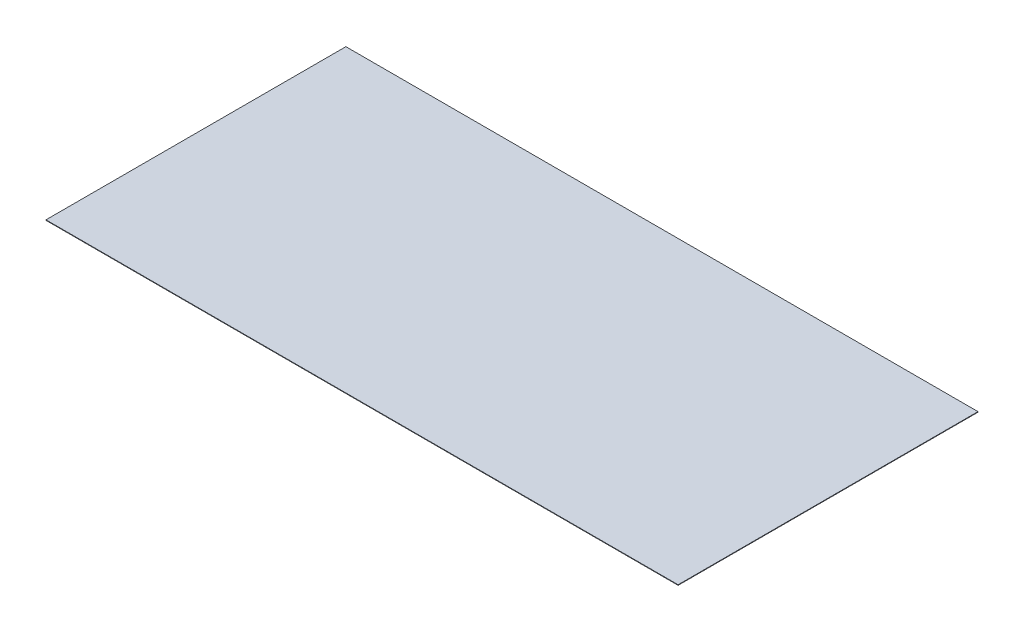
ISO-10303-21;
HEADER;
FILE_DESCRIPTION(('STEP AP214'),'2;1');
FILE_NAME('part.step','',(''),(''),'','','');
FILE_SCHEMA(('AUTOMOTIVE_DESIGN { 1 0 10303 214 1 1 1 1 }'));
ENDSEC;
DATA;
#1=APPLICATION_CONTEXT('core data for automotive mechanical design processes');
#2=APPLICATION_PROTOCOL_DEFINITION('international standard','automotive_design',2000,#1);
#3=PRODUCT_CONTEXT('',#1,'mechanical');
#4=PRODUCT('Part','Part','',(#3));
#5=PRODUCT_RELATED_PRODUCT_CATEGORY('part','',(#4));
#6=PRODUCT_DEFINITION_FORMATION('','',#4);
#7=PRODUCT_DEFINITION_CONTEXT('part definition',#1,'design');
#8=PRODUCT_DEFINITION('design','',#6,#7);
#9=PRODUCT_DEFINITION_SHAPE('','',#8);
#10=(LENGTH_UNIT() NAMED_UNIT(*) SI_UNIT(.MILLI.,.METRE.));
#11=(NAMED_UNIT(*) PLANE_ANGLE_UNIT() SI_UNIT($,.RADIAN.));
#12=(NAMED_UNIT(*) SI_UNIT($,.STERADIAN.) SOLID_ANGLE_UNIT());
#13=UNCERTAINTY_MEASURE_WITH_UNIT(LENGTH_MEASURE(1.E-05),#10,'distance_accuracy_value','');
#14=(GEOMETRIC_REPRESENTATION_CONTEXT(3) GLOBAL_UNCERTAINTY_ASSIGNED_CONTEXT((#13)) GLOBAL_UNIT_ASSIGNED_CONTEXT((#10,
#11,#12)) REPRESENTATION_CONTEXT('',''));
#15=CARTESIAN_POINT('',(0.,0.,0.));
#16=DIRECTION('',(0.,0.,1.));
#17=DIRECTION('',(1.,0.,0.));
#18=AXIS2_PLACEMENT_3D('',#15,#16,#17);
#19=CARTESIAN_POINT('',(546.80945523174,1.,145.385451325627));
#20=DIRECTION('',(-1.,0.,0.));
#21=DIRECTION('',(0.,0.,1.));
#22=AXIS2_PLACEMENT_3D('',#19,#20,#21);
#23=PLANE('',#22);
#24=DIRECTION('',(0.,0.,-1.));
#25=VECTOR('',#24,1.);
#26=CARTESIAN_POINT('',(546.80945523174,0.,145.385451325627));
#27=LINE('',#26,#25);
#28=CARTESIAN_POINT('',(546.80945523174,0.,145.385451325627));
#29=VERTEX_POINT('',#28);
#30=CARTESIAN_POINT('',(546.80945523174,0.,-447.614548674373));
#31=VERTEX_POINT('',#30);
#32=EDGE_CURVE('E96',#29,#31,#27,.T.);
#33=ORIENTED_EDGE('',*,*,#32,.T.);
#34=DIRECTION('',(0.,-1.,0.));
#35=VECTOR('',#34,1.);
#36=CARTESIAN_POINT('',(546.80945523174,1.,-447.614548674373));
#37=LINE('',#36,#35);
#38=CARTESIAN_POINT('',(546.80945523174,1.,-447.614548674373));
#39=VERTEX_POINT('',#38);
#40=EDGE_CURVE('E11',#39,#31,#37,.T.);
#41=ORIENTED_EDGE('',*,*,#40,.F.);
#42=DIRECTION('',(0.,0.,-1.));
#43=VECTOR('',#42,1.);
#44=CARTESIAN_POINT('',(546.80945523174,1.,145.385451325627));
#45=LINE('',#44,#43);
#46=CARTESIAN_POINT('',(546.80945523174,1.,145.385451325627));
#47=VERTEX_POINT('',#46);
#48=EDGE_CURVE('E84',#47,#39,#45,.T.);
#49=ORIENTED_EDGE('',*,*,#48,.F.);
#50=DIRECTION('',(0.,-1.,0.));
#51=VECTOR('',#50,1.);
#52=CARTESIAN_POINT('',(546.80945523174,1.,145.385451325627));
#53=LINE('',#52,#51);
#54=EDGE_CURVE('E92',#47,#29,#53,.T.);
#55=ORIENTED_EDGE('',*,*,#54,.T.);
#56=EDGE_LOOP('',(#33,#41,#49,#55));
#57=FACE_BOUND('',#56,.T.);
#58=ADVANCED_FACE('F33',(#57),#23,.F.);
#59=CARTESIAN_POINT('',(546.80945523174,1.,-447.614548674373));
#60=DIRECTION('',(0.,0.,1.));
#61=DIRECTION('',(1.,0.,0.));
#62=AXIS2_PLACEMENT_3D('',#59,#60,#61);
#63=PLANE('',#62);
#64=DIRECTION('',(-1.,0.,0.));
#65=VECTOR('',#64,1.);
#66=CARTESIAN_POINT('',(546.80945523174,0.,-447.614548674373));
#67=LINE('',#66,#65);
#68=CARTESIAN_POINT('',(-703.19054476826,0.,-447.614548674373));
#69=VERTEX_POINT('',#68);
#70=EDGE_CURVE('E88',#31,#69,#67,.T.);
#71=ORIENTED_EDGE('',*,*,#70,.T.);
#72=DIRECTION('',(0.,-1.,0.));
#73=VECTOR('',#72,1.);
#74=CARTESIAN_POINT('',(-703.19054476826,1.,-447.614548674373));
#75=LINE('',#74,#73);
#76=CARTESIAN_POINT('',(-703.19054476826,1.,-447.614548674373));
#77=VERTEX_POINT('',#76);
#78=EDGE_CURVE('E41',#77,#69,#75,.T.);
#79=ORIENTED_EDGE('',*,*,#78,.F.);
#80=DIRECTION('',(-1.,0.,0.));
#81=VECTOR('',#80,1.);
#82=CARTESIAN_POINT('',(546.80945523174,1.,-447.614548674373));
#83=LINE('',#82,#81);
#84=EDGE_CURVE('E79',#39,#77,#83,.T.);
#85=ORIENTED_EDGE('',*,*,#84,.F.);
#86=ORIENTED_EDGE('',*,*,#40,.T.);
#87=EDGE_LOOP('',(#71,#79,#85,#86));
#88=FACE_BOUND('',#87,.T.);
#89=ADVANCED_FACE('F87',(#88),#63,.F.);
#90=CARTESIAN_POINT('',(-703.19054476826,1.,145.385451325627));
#91=DIRECTION('',(1.,0.,0.));
#92=DIRECTION('',(0.,0.,-1.));
#93=AXIS2_PLACEMENT_3D('',#90,#91,#92);
#94=PLANE('',#93);
#95=DIRECTION('',(0.,0.,1.));
#96=VECTOR('',#95,1.);
#97=CARTESIAN_POINT('',(-703.19054476826,0.,145.385451325627));
#98=LINE('',#97,#96);
#99=CARTESIAN_POINT('',(-703.19054476826,0.,145.385451325627));
#100=VERTEX_POINT('',#99);
#101=EDGE_CURVE('E66',#69,#100,#98,.T.);
#102=ORIENTED_EDGE('',*,*,#101,.T.);
#103=DIRECTION('',(0.,-1.,0.));
#104=VECTOR('',#103,1.);
#105=CARTESIAN_POINT('',(-703.19054476826,1.,145.385451325627));
#106=LINE('',#105,#104);
#107=CARTESIAN_POINT('',(-703.19054476826,1.,145.385451325627));
#108=VERTEX_POINT('',#107);
#109=EDGE_CURVE('E89',#108,#100,#106,.T.);
#110=ORIENTED_EDGE('',*,*,#109,.F.);
#111=DIRECTION('',(0.,0.,1.));
#112=VECTOR('',#111,1.);
#113=CARTESIAN_POINT('',(-703.19054476826,1.,145.385451325627));
#114=LINE('',#113,#112);
#115=EDGE_CURVE('E82',#77,#108,#114,.T.);
#116=ORIENTED_EDGE('',*,*,#115,.F.);
#117=ORIENTED_EDGE('',*,*,#78,.T.);
#118=EDGE_LOOP('',(#102,#110,#116,#117));
#119=FACE_BOUND('',#118,.T.);
#120=ADVANCED_FACE('F90',(#119),#94,.F.);
#121=CARTESIAN_POINT('',(546.80945523174,1.,145.385451325627));
#122=DIRECTION('',(0.,0.,-1.));
#123=DIRECTION('',(-1.,0.,0.));
#124=AXIS2_PLACEMENT_3D('',#121,#122,#123);
#125=PLANE('',#124);
#126=DIRECTION('',(1.,0.,0.));
#127=VECTOR('',#126,1.);
#128=CARTESIAN_POINT('',(546.80945523174,0.,145.385451325627));
#129=LINE('',#128,#127);
#130=EDGE_CURVE('E72',#100,#29,#129,.T.);
#131=ORIENTED_EDGE('',*,*,#130,.T.);
#132=ORIENTED_EDGE('',*,*,#54,.F.);
#133=DIRECTION('',(1.,0.,0.));
#134=VECTOR('',#133,1.);
#135=CARTESIAN_POINT('',(546.80945523174,1.,145.385451325627));
#136=LINE('',#135,#134);
#137=EDGE_CURVE('E49',#108,#47,#136,.T.);
#138=ORIENTED_EDGE('',*,*,#137,.F.);
#139=ORIENTED_EDGE('',*,*,#109,.T.);
#140=EDGE_LOOP('',(#131,#132,#138,#139));
#141=FACE_BOUND('',#140,.T.);
#142=ADVANCED_FACE('F103',(#141),#125,.F.);
#143=CARTESIAN_POINT('',(0.,1.,0.));
#144=DIRECTION('',(0.,1.,0.));
#145=DIRECTION('',(0.,0.,1.));
#146=AXIS2_PLACEMENT_3D('',#143,#144,#145);
#147=PLANE('',#146);
#148=ORIENTED_EDGE('',*,*,#48,.T.);
#149=ORIENTED_EDGE('',*,*,#84,.T.);
#150=ORIENTED_EDGE('',*,*,#115,.T.);
#151=ORIENTED_EDGE('',*,*,#137,.T.);
#152=EDGE_LOOP('',(#148,#149,#150,#151));
#153=FACE_BOUND('',#152,.T.);
#154=ADVANCED_FACE('F80',(#153),#147,.T.);
#155=CARTESIAN_POINT('',(0.,0.,0.));
#156=DIRECTION('',(0.,1.,0.));
#157=DIRECTION('',(0.,0.,1.));
#158=AXIS2_PLACEMENT_3D('',#155,#156,#157);
#159=PLANE('',#158);
#160=ORIENTED_EDGE('',*,*,#32,.F.);
#161=ORIENTED_EDGE('',*,*,#130,.F.);
#162=ORIENTED_EDGE('',*,*,#101,.F.);
#163=ORIENTED_EDGE('',*,*,#70,.F.);
#164=EDGE_LOOP('',(#160,#161,#162,#163));
#165=FACE_BOUND('',#164,.T.);
#166=ADVANCED_FACE('F106',(#165),#159,.F.);
#167=CLOSED_SHELL('',(#58,#89,#120,#142,#154,#166));
#168=MANIFOLD_SOLID_BREP('B2',#167);
#169=ADVANCED_BREP_SHAPE_REPRESENTATION('',(#18,#168),#14);
#170=SHAPE_DEFINITION_REPRESENTATION(#9,#169);
ENDSEC;
END-ISO-10303-21;
